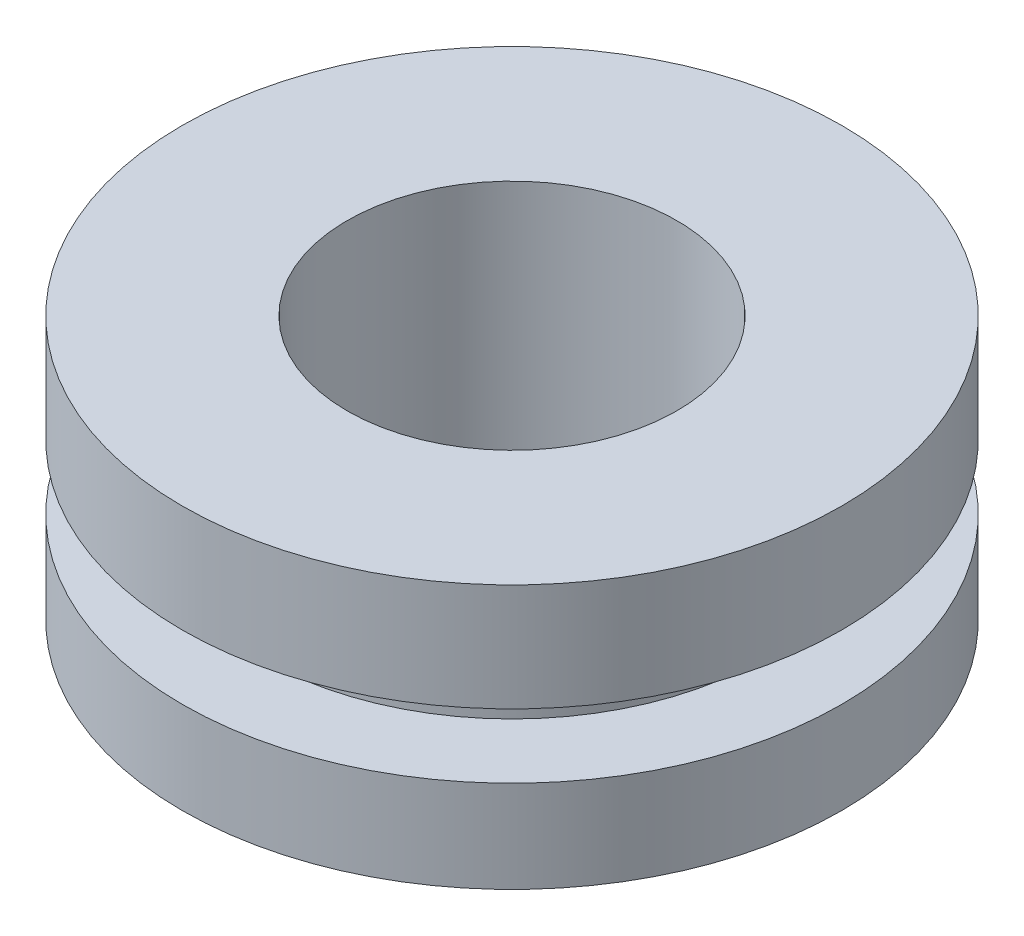
ISO-10303-21;
HEADER;
FILE_DESCRIPTION(('STEP AP214'),'2;1');
FILE_NAME('part.step','',(''),(''),'','','');
FILE_SCHEMA(('AUTOMOTIVE_DESIGN { 1 0 10303 214 1 1 1 1 }'));
ENDSEC;
DATA;
#1=APPLICATION_CONTEXT('core data for automotive mechanical design processes');
#2=APPLICATION_PROTOCOL_DEFINITION('international standard','automotive_design',2000,#1);
#3=PRODUCT_CONTEXT('',#1,'mechanical');
#4=PRODUCT('Part','Part','',(#3));
#5=PRODUCT_RELATED_PRODUCT_CATEGORY('part','',(#4));
#6=PRODUCT_DEFINITION_FORMATION('','',#4);
#7=PRODUCT_DEFINITION_CONTEXT('part definition',#1,'design');
#8=PRODUCT_DEFINITION('design','',#6,#7);
#9=PRODUCT_DEFINITION_SHAPE('','',#8);
#10=(LENGTH_UNIT() NAMED_UNIT(*) SI_UNIT(.MILLI.,.METRE.));
#11=(NAMED_UNIT(*) PLANE_ANGLE_UNIT() SI_UNIT($,.RADIAN.));
#12=(NAMED_UNIT(*) SI_UNIT($,.STERADIAN.) SOLID_ANGLE_UNIT());
#13=UNCERTAINTY_MEASURE_WITH_UNIT(LENGTH_MEASURE(1.E-05),#10,'distance_accuracy_value','');
#14=(GEOMETRIC_REPRESENTATION_CONTEXT(3) GLOBAL_UNCERTAINTY_ASSIGNED_CONTEXT((#13)) GLOBAL_UNIT_ASSIGNED_CONTEXT((#10,
#11,#12)) REPRESENTATION_CONTEXT('',''));
#15=CARTESIAN_POINT('',(0.,0.,0.));
#16=DIRECTION('',(0.,0.,1.));
#17=DIRECTION('',(1.,0.,0.));
#18=AXIS2_PLACEMENT_3D('',#15,#16,#17);
#19=CARTESIAN_POINT('',(0.,4.,0.));
#20=DIRECTION('',(0.,-1.,0.));
#21=DIRECTION('',(0.,0.,-1.));
#22=AXIS2_PLACEMENT_3D('',#19,#20,#21);
#23=CYLINDRICAL_SURFACE('',#22,5.);
#24=CARTESIAN_POINT('',(0.,2.37132795063131,0.));
#25=DIRECTION('',(0.,1.,0.));
#26=DIRECTION('',(0.,0.,1.));
#27=AXIS2_PLACEMENT_3D('',#24,#25,#26);
#28=CIRCLE('',#27,5.);
#29=CARTESIAN_POINT('',(0.,2.37132795063131,5.));
#30=VERTEX_POINT('',#29);
#31=EDGE_CURVE('E49',#30,#30,#28,.T.);
#32=ORIENTED_EDGE('',*,*,#31,.T.);
#33=EDGE_LOOP('',(#32));
#34=FACE_BOUND('',#33,.T.);
#35=CARTESIAN_POINT('',(0.,4.,0.));
#36=DIRECTION('',(0.,1.,0.));
#37=DIRECTION('',(0.,0.,1.));
#38=AXIS2_PLACEMENT_3D('',#35,#36,#37);
#39=CIRCLE('',#38,5.);
#40=CARTESIAN_POINT('',(0.,4.,5.));
#41=VERTEX_POINT('',#40);
#42=EDGE_CURVE('E10',#41,#41,#39,.T.);
#43=ORIENTED_EDGE('',*,*,#42,.F.);
#44=EDGE_LOOP('',(#43));
#45=FACE_BOUND('',#44,.T.);
#46=ADVANCED_FACE('F33',(#34,#45),#23,.T.);
#47=CARTESIAN_POINT('',(0.,4.,0.));
#48=DIRECTION('',(0.,1.,0.));
#49=DIRECTION('',(0.,0.,1.));
#50=AXIS2_PLACEMENT_3D('',#47,#48,#49);
#51=PLANE('',#50);
#52=ORIENTED_EDGE('',*,*,#42,.T.);
#53=EDGE_LOOP('',(#52));
#54=FACE_BOUND('',#53,.T.);
#55=CARTESIAN_POINT('',(0.,4.,0.));
#56=DIRECTION('',(0.,1.,0.));
#57=DIRECTION('',(0.,0.,1.));
#58=AXIS2_PLACEMENT_3D('',#55,#56,#57);
#59=CIRCLE('',#58,2.5);
#60=CARTESIAN_POINT('',(0.,4.,2.5));
#61=VERTEX_POINT('',#60);
#62=EDGE_CURVE('E44',#61,#61,#59,.T.);
#63=ORIENTED_EDGE('',*,*,#62,.F.);
#64=EDGE_LOOP('',(#63));
#65=FACE_BOUND('',#64,.T.);
#66=ADVANCED_FACE('F74',(#54,#65),#51,.T.);
#67=CARTESIAN_POINT('',(0.,0.,0.));
#68=DIRECTION('',(0.,1.,0.));
#69=DIRECTION('',(0.,0.,1.));
#70=AXIS2_PLACEMENT_3D('',#67,#68,#69);
#71=PLANE('',#70);
#72=CARTESIAN_POINT('',(0.,0.,0.));
#73=DIRECTION('',(0.,1.,0.));
#74=DIRECTION('',(0.,0.,1.));
#75=AXIS2_PLACEMENT_3D('',#72,#73,#74);
#76=CIRCLE('',#75,5.);
#77=CARTESIAN_POINT('',(0.,0.,5.));
#78=VERTEX_POINT('',#77);
#79=EDGE_CURVE('E37',#78,#78,#76,.T.);
#80=ORIENTED_EDGE('',*,*,#79,.F.);
#81=EDGE_LOOP('',(#80));
#82=FACE_BOUND('',#81,.T.);
#83=CARTESIAN_POINT('',(0.,0.,0.));
#84=DIRECTION('',(0.,1.,0.));
#85=DIRECTION('',(0.,0.,1.));
#86=AXIS2_PLACEMENT_3D('',#83,#84,#85);
#87=CIRCLE('',#86,2.5);
#88=CARTESIAN_POINT('',(0.,0.,2.5));
#89=VERTEX_POINT('',#88);
#90=EDGE_CURVE('E46',#89,#89,#87,.T.);
#91=ORIENTED_EDGE('',*,*,#90,.T.);
#92=EDGE_LOOP('',(#91));
#93=FACE_BOUND('',#92,.T.);
#94=ADVANCED_FACE('F69',(#82,#93),#71,.F.);
#95=CARTESIAN_POINT('',(0.,1.39538843793237,0.));
#96=DIRECTION('',(0.,1.,0.));
#97=DIRECTION('',(0.,0.,1.));
#98=AXIS2_PLACEMENT_3D('',#95,#96,#97);
#99=CIRCLE('',#98,5.);
#100=CARTESIAN_POINT('',(0.,1.39538843793237,5.));
#101=VERTEX_POINT('',#100);
#102=EDGE_CURVE('E60',#101,#101,#99,.T.);
#103=ORIENTED_EDGE('',*,*,#102,.F.);
#104=EDGE_LOOP('',(#103));
#105=FACE_BOUND('',#104,.T.);
#106=ORIENTED_EDGE('',*,*,#79,.T.);
#107=EDGE_LOOP('',(#106));
#108=FACE_BOUND('',#107,.T.);
#109=ADVANCED_FACE('F35',(#105,#108),#23,.T.);
#110=CARTESIAN_POINT('',(0.,4.,0.));
#111=DIRECTION('',(0.,-1.,0.));
#112=DIRECTION('',(0.,0.,-1.));
#113=AXIS2_PLACEMENT_3D('',#110,#111,#112);
#114=CYLINDRICAL_SURFACE('',#113,2.5);
#115=ORIENTED_EDGE('',*,*,#62,.T.);
#116=EDGE_LOOP('',(#115));
#117=FACE_BOUND('',#116,.T.);
#118=ORIENTED_EDGE('',*,*,#90,.F.);
#119=EDGE_LOOP('',(#118));
#120=FACE_BOUND('',#119,.T.);
#121=ADVANCED_FACE('F68',(#117,#120),#114,.F.);
#122=CARTESIAN_POINT('',(-5.,2.37132795063131,0.));
#123=DIRECTION('',(0.,1.,0.));
#124=DIRECTION('',(0.,0.,1.));
#125=AXIS2_PLACEMENT_3D('',#122,#123,#124);
#126=PLANE('',#125);
#127=ORIENTED_EDGE('',*,*,#31,.F.);
#128=EDGE_LOOP('',(#127));
#129=FACE_BOUND('',#128,.T.);
#130=CARTESIAN_POINT('',(0.,2.37132795063131,0.));
#131=DIRECTION('',(0.,1.,0.));
#132=DIRECTION('',(0.,0.,1.));
#133=AXIS2_PLACEMENT_3D('',#130,#131,#132);
#134=CIRCLE('',#133,3.80677027313625);
#135=CARTESIAN_POINT('',(0.,2.37132795063131,3.80677027313625));
#136=VERTEX_POINT('',#135);
#137=EDGE_CURVE('E54',#136,#136,#134,.T.);
#138=ORIENTED_EDGE('',*,*,#137,.T.);
#139=EDGE_LOOP('',(#138));
#140=FACE_BOUND('',#139,.T.);
#141=ADVANCED_FACE('F78',(#129,#140),#126,.F.);
#142=CARTESIAN_POINT('',(0.,4.,0.));
#143=DIRECTION('',(0.,1.,0.));
#144=DIRECTION('',(0.,0.,1.));
#145=AXIS2_PLACEMENT_3D('',#142,#143,#144);
#146=CYLINDRICAL_SURFACE('',#145,3.80677027313625);
#147=ORIENTED_EDGE('',*,*,#137,.F.);
#148=EDGE_LOOP('',(#147));
#149=FACE_BOUND('',#148,.T.);
#150=CARTESIAN_POINT('',(0.,1.39538843793237,0.));
#151=DIRECTION('',(0.,1.,0.));
#152=DIRECTION('',(0.,0.,1.));
#153=AXIS2_PLACEMENT_3D('',#150,#151,#152);
#154=CIRCLE('',#153,3.80677027313625);
#155=CARTESIAN_POINT('',(0.,1.39538843793237,3.80677027313625));
#156=VERTEX_POINT('',#155);
#157=EDGE_CURVE('E57',#156,#156,#154,.T.);
#158=ORIENTED_EDGE('',*,*,#157,.T.);
#159=EDGE_LOOP('',(#158));
#160=FACE_BOUND('',#159,.T.);
#161=ADVANCED_FACE('F84',(#149,#160),#146,.T.);
#162=CARTESIAN_POINT('',(-3.80677027313625,1.39538843793237,0.));
#163=DIRECTION('',(0.,-1.,0.));
#164=DIRECTION('',(0.,0.,-1.));
#165=AXIS2_PLACEMENT_3D('',#162,#163,#164);
#166=PLANE('',#165);
#167=ORIENTED_EDGE('',*,*,#157,.F.);
#168=EDGE_LOOP('',(#167));
#169=FACE_BOUND('',#168,.T.);
#170=ORIENTED_EDGE('',*,*,#102,.T.);
#171=EDGE_LOOP('',(#170));
#172=FACE_BOUND('',#171,.T.);
#173=ADVANCED_FACE('F64',(#169,#172),#166,.F.);
#174=CLOSED_SHELL('',(#46,#66,#94,#109,#121,#141,#161,#173));
#175=MANIFOLD_SOLID_BREP('B2',#174);
#176=ADVANCED_BREP_SHAPE_REPRESENTATION('',(#18,#175),#14);
#177=SHAPE_DEFINITION_REPRESENTATION(#9,#176);
ENDSEC;
END-ISO-10303-21;
